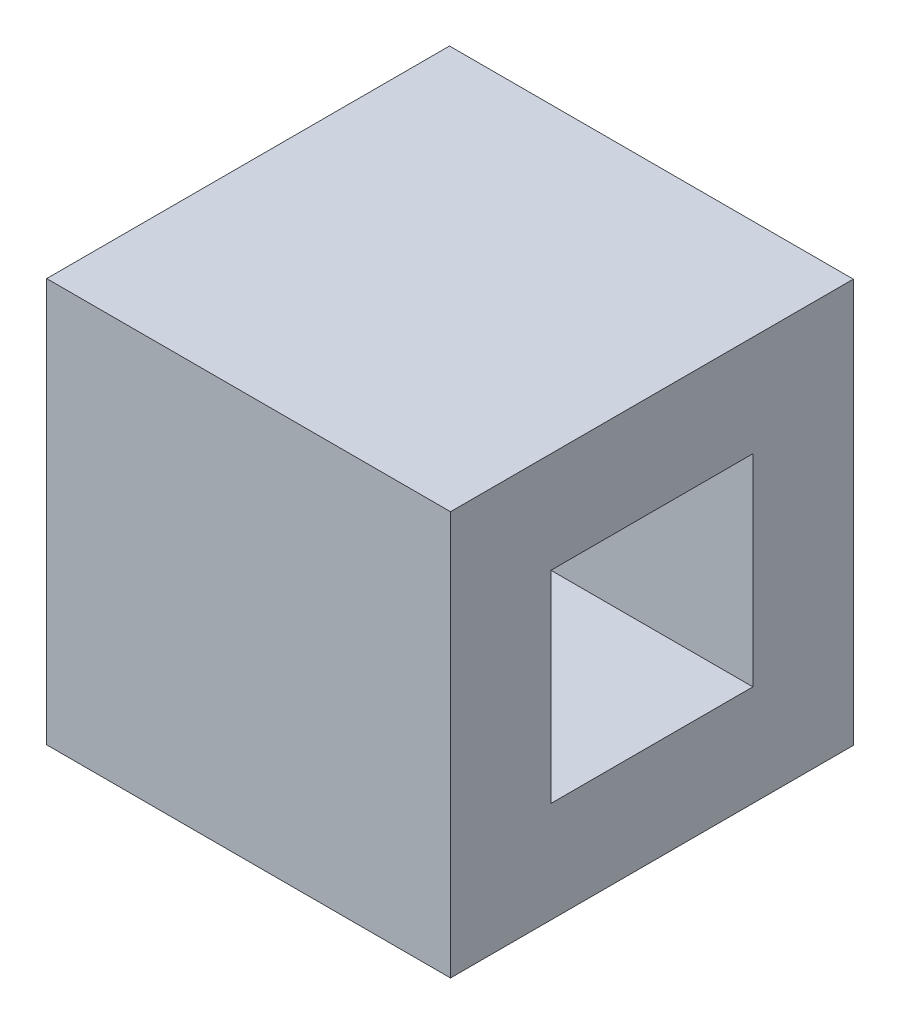
ISO-10303-21;
HEADER;
FILE_DESCRIPTION(('STEP AP214'),'2;1');
FILE_NAME('part.step','',(''),(''),'','','');
FILE_SCHEMA(('AUTOMOTIVE_DESIGN { 1 0 10303 214 1 1 1 1 }'));
ENDSEC;
DATA;
#1=APPLICATION_CONTEXT('core data for automotive mechanical design processes');
#2=APPLICATION_PROTOCOL_DEFINITION('international standard','automotive_design',2000,#1);
#3=PRODUCT_CONTEXT('',#1,'mechanical');
#4=PRODUCT('Part','Part','',(#3));
#5=PRODUCT_RELATED_PRODUCT_CATEGORY('part','',(#4));
#6=PRODUCT_DEFINITION_FORMATION('','',#4);
#7=PRODUCT_DEFINITION_CONTEXT('part definition',#1,'design');
#8=PRODUCT_DEFINITION('design','',#6,#7);
#9=PRODUCT_DEFINITION_SHAPE('','',#8);
#10=(LENGTH_UNIT() NAMED_UNIT(*) SI_UNIT(.MILLI.,.METRE.));
#11=(NAMED_UNIT(*) PLANE_ANGLE_UNIT() SI_UNIT($,.RADIAN.));
#12=(NAMED_UNIT(*) SI_UNIT($,.STERADIAN.) SOLID_ANGLE_UNIT());
#13=UNCERTAINTY_MEASURE_WITH_UNIT(LENGTH_MEASURE(1.E-05),#10,'distance_accuracy_value','');
#14=(GEOMETRIC_REPRESENTATION_CONTEXT(3) GLOBAL_UNCERTAINTY_ASSIGNED_CONTEXT((#13)) GLOBAL_UNIT_ASSIGNED_CONTEXT((#10,
#11,#12)) REPRESENTATION_CONTEXT('',''));
#15=CARTESIAN_POINT('',(0.,0.,0.));
#16=DIRECTION('',(0.,0.,1.));
#17=DIRECTION('',(1.,0.,0.));
#18=AXIS2_PLACEMENT_3D('',#15,#16,#17);
#19=CARTESIAN_POINT('',(0.,40.,0.));
#20=DIRECTION('',(-1.,0.,0.));
#21=DIRECTION('',(0.,0.,1.));
#22=AXIS2_PLACEMENT_3D('',#19,#20,#21);
#23=PLANE('',#22);
#24=DIRECTION('',(0.,0.,-1.));
#25=VECTOR('',#24,1.);
#26=CARTESIAN_POINT('',(0.,10.,-29.95));
#27=LINE('',#26,#25);
#28=CARTESIAN_POINT('',(0.,10.,-9.95));
#29=VERTEX_POINT('',#28);
#30=CARTESIAN_POINT('',(0.,10.,-29.95));
#31=VERTEX_POINT('',#30);
#32=EDGE_CURVE('E137',#29,#31,#27,.T.);
#33=ORIENTED_EDGE('',*,*,#32,.F.);
#34=DIRECTION('',(0.,-1.,0.));
#35=VECTOR('',#34,1.);
#36=CARTESIAN_POINT('',(0.,30.,-9.94999999999999));
#37=LINE('',#36,#35);
#38=CARTESIAN_POINT('',(0.,30.,-9.94999999999999));
#39=VERTEX_POINT('',#38);
#40=EDGE_CURVE('E49',#39,#29,#37,.T.);
#41=ORIENTED_EDGE('',*,*,#40,.F.);
#42=DIRECTION('',(0.,0.,1.));
#43=VECTOR('',#42,1.);
#44=CARTESIAN_POINT('',(0.,30.,-29.95));
#45=LINE('',#44,#43);
#46=CARTESIAN_POINT('',(0.,30.,-29.95));
#47=VERTEX_POINT('',#46);
#48=EDGE_CURVE('E128',#47,#39,#45,.T.);
#49=ORIENTED_EDGE('',*,*,#48,.F.);
#50=DIRECTION('',(0.,1.,0.));
#51=VECTOR('',#50,1.);
#52=CARTESIAN_POINT('',(0.,30.,-29.95));
#53=LINE('',#52,#51);
#54=EDGE_CURVE('E131',#31,#47,#53,.T.);
#55=ORIENTED_EDGE('',*,*,#54,.F.);
#56=EDGE_LOOP('',(#33,#41,#49,#55));
#57=FACE_BOUND('',#56,.T.);
#58=DIRECTION('',(0.,0.,-1.));
#59=VECTOR('',#58,1.);
#60=CARTESIAN_POINT('',(0.,0.,0.));
#61=LINE('',#60,#59);
#62=CARTESIAN_POINT('',(0.,0.,0.));
#63=VERTEX_POINT('',#62);
#64=CARTESIAN_POINT('',(0.,0.,-39.9));
#65=VERTEX_POINT('',#64);
#66=EDGE_CURVE('E143',#63,#65,#61,.T.);
#67=ORIENTED_EDGE('',*,*,#66,.T.);
#68=DIRECTION('',(0.,-1.,0.));
#69=VECTOR('',#68,1.);
#70=CARTESIAN_POINT('',(0.,40.,-39.9));
#71=LINE('',#70,#69);
#72=CARTESIAN_POINT('',(0.,40.,-39.9));
#73=VERTEX_POINT('',#72);
#74=EDGE_CURVE('E11',#73,#65,#71,.T.);
#75=ORIENTED_EDGE('',*,*,#74,.F.);
#76=DIRECTION('',(0.,0.,-1.));
#77=VECTOR('',#76,1.);
#78=CARTESIAN_POINT('',(0.,40.,0.));
#79=LINE('',#78,#77);
#80=CARTESIAN_POINT('',(0.,40.,0.));
#81=VERTEX_POINT('',#80);
#82=EDGE_CURVE('E147',#81,#73,#79,.T.);
#83=ORIENTED_EDGE('',*,*,#82,.F.);
#84=DIRECTION('',(0.,-1.,0.));
#85=VECTOR('',#84,1.);
#86=CARTESIAN_POINT('',(0.,40.,0.));
#87=LINE('',#86,#85);
#88=EDGE_CURVE('E153',#81,#63,#87,.T.);
#89=ORIENTED_EDGE('',*,*,#88,.T.);
#90=EDGE_LOOP('',(#67,#75,#83,#89));
#91=FACE_BOUND('',#90,.T.);
#92=ADVANCED_FACE('F35',(#57,#91),#23,.F.);
#93=CARTESIAN_POINT('',(0.,40.,-39.9));
#94=DIRECTION('',(0.,0.,1.));
#95=DIRECTION('',(1.,0.,0.));
#96=AXIS2_PLACEMENT_3D('',#93,#94,#95);
#97=PLANE('',#96);
#98=DIRECTION('',(-1.,0.,0.));
#99=VECTOR('',#98,1.);
#100=CARTESIAN_POINT('',(0.,0.,-39.9));
#101=LINE('',#100,#99);
#102=CARTESIAN_POINT('',(-40.,0.,-39.9));
#103=VERTEX_POINT('',#102);
#104=EDGE_CURVE('E156',#65,#103,#101,.T.);
#105=ORIENTED_EDGE('',*,*,#104,.T.);
#106=DIRECTION('',(0.,-1.,0.));
#107=VECTOR('',#106,1.);
#108=CARTESIAN_POINT('',(-40.,40.,-39.9));
#109=LINE('',#108,#107);
#110=CARTESIAN_POINT('',(-40.,40.,-39.9));
#111=VERTEX_POINT('',#110);
#112=EDGE_CURVE('E42',#111,#103,#109,.T.);
#113=ORIENTED_EDGE('',*,*,#112,.F.);
#114=DIRECTION('',(-1.,0.,0.));
#115=VECTOR('',#114,1.);
#116=CARTESIAN_POINT('',(0.,40.,-39.9));
#117=LINE('',#116,#115);
#118=EDGE_CURVE('E86',#73,#111,#117,.T.);
#119=ORIENTED_EDGE('',*,*,#118,.F.);
#120=ORIENTED_EDGE('',*,*,#74,.T.);
#121=EDGE_LOOP('',(#105,#113,#119,#120));
#122=FACE_BOUND('',#121,.T.);
#123=ADVANCED_FACE('F184',(#122),#97,.F.);
#124=CARTESIAN_POINT('',(-40.,40.,0.));
#125=DIRECTION('',(1.,0.,0.));
#126=DIRECTION('',(0.,0.,-1.));
#127=AXIS2_PLACEMENT_3D('',#124,#125,#126);
#128=PLANE('',#127);
#129=DIRECTION('',(0.,0.,1.));
#130=VECTOR('',#129,1.);
#131=CARTESIAN_POINT('',(-40.,0.,0.));
#132=LINE('',#131,#130);
#133=CARTESIAN_POINT('',(-40.,0.,0.));
#134=VERTEX_POINT('',#133);
#135=EDGE_CURVE('E158',#103,#134,#132,.T.);
#136=ORIENTED_EDGE('',*,*,#135,.T.);
#137=DIRECTION('',(0.,-1.,0.));
#138=VECTOR('',#137,1.);
#139=CARTESIAN_POINT('',(-40.,40.,0.));
#140=LINE('',#139,#138);
#141=CARTESIAN_POINT('',(-40.,40.,0.));
#142=VERTEX_POINT('',#141);
#143=EDGE_CURVE('E162',#142,#134,#140,.T.);
#144=ORIENTED_EDGE('',*,*,#143,.F.);
#145=DIRECTION('',(0.,0.,1.));
#146=VECTOR('',#145,1.);
#147=CARTESIAN_POINT('',(-40.,40.,0.));
#148=LINE('',#147,#146);
#149=EDGE_CURVE('E150',#111,#142,#148,.T.);
#150=ORIENTED_EDGE('',*,*,#149,.F.);
#151=ORIENTED_EDGE('',*,*,#112,.T.);
#152=EDGE_LOOP('',(#136,#144,#150,#151));
#153=FACE_BOUND('',#152,.T.);
#154=ADVANCED_FACE('F167',(#153),#128,.F.);
#155=CARTESIAN_POINT('',(0.,40.,0.));
#156=DIRECTION('',(0.,0.,-1.));
#157=DIRECTION('',(-1.,0.,0.));
#158=AXIS2_PLACEMENT_3D('',#155,#156,#157);
#159=PLANE('',#158);
#160=DIRECTION('',(1.,0.,0.));
#161=VECTOR('',#160,1.);
#162=CARTESIAN_POINT('',(0.,0.,0.));
#163=LINE('',#162,#161);
#164=EDGE_CURVE('E79',#134,#63,#163,.T.);
#165=ORIENTED_EDGE('',*,*,#164,.T.);
#166=ORIENTED_EDGE('',*,*,#88,.F.);
#167=DIRECTION('',(1.,0.,0.));
#168=VECTOR('',#167,1.);
#169=CARTESIAN_POINT('',(0.,40.,0.));
#170=LINE('',#169,#168);
#171=EDGE_CURVE('E58',#142,#81,#170,.T.);
#172=ORIENTED_EDGE('',*,*,#171,.F.);
#173=ORIENTED_EDGE('',*,*,#143,.T.);
#174=EDGE_LOOP('',(#165,#166,#172,#173));
#175=FACE_BOUND('',#174,.T.);
#176=ADVANCED_FACE('F175',(#175),#159,.F.);
#177=CARTESIAN_POINT('',(0.,40.,0.));
#178=DIRECTION('',(0.,1.,0.));
#179=DIRECTION('',(0.,0.,1.));
#180=AXIS2_PLACEMENT_3D('',#177,#178,#179);
#181=PLANE('',#180);
#182=ORIENTED_EDGE('',*,*,#82,.T.);
#183=ORIENTED_EDGE('',*,*,#118,.T.);
#184=ORIENTED_EDGE('',*,*,#149,.T.);
#185=ORIENTED_EDGE('',*,*,#171,.T.);
#186=EDGE_LOOP('',(#182,#183,#184,#185));
#187=FACE_BOUND('',#186,.T.);
#188=ADVANCED_FACE('F177',(#187),#181,.T.);
#189=CARTESIAN_POINT('',(0.,0.,0.));
#190=DIRECTION('',(0.,1.,0.));
#191=DIRECTION('',(0.,0.,1.));
#192=AXIS2_PLACEMENT_3D('',#189,#190,#191);
#193=PLANE('',#192);
#194=ORIENTED_EDGE('',*,*,#66,.F.);
#195=ORIENTED_EDGE('',*,*,#164,.F.);
#196=ORIENTED_EDGE('',*,*,#135,.F.);
#197=ORIENTED_EDGE('',*,*,#104,.F.);
#198=EDGE_LOOP('',(#194,#195,#196,#197));
#199=FACE_BOUND('',#198,.T.);
#200=ADVANCED_FACE('F171',(#199),#193,.F.);
#201=CARTESIAN_POINT('',(-20.,30.,-9.94999999999999));
#202=DIRECTION('',(0.,0.,1.));
#203=DIRECTION('',(0.,-1.,0.));
#204=AXIS2_PLACEMENT_3D('',#201,#202,#203);
#205=PLANE('',#204);
#206=ORIENTED_EDGE('',*,*,#40,.T.);
#207=DIRECTION('',(1.,0.,0.));
#208=VECTOR('',#207,1.);
#209=CARTESIAN_POINT('',(-20.,10.,-9.95));
#210=LINE('',#209,#208);
#211=CARTESIAN_POINT('',(-20.,10.,-9.95));
#212=VERTEX_POINT('',#211);
#213=EDGE_CURVE('E106',#212,#29,#210,.T.);
#214=ORIENTED_EDGE('',*,*,#213,.F.);
#215=DIRECTION('',(0.,-1.,0.));
#216=VECTOR('',#215,1.);
#217=CARTESIAN_POINT('',(-20.,30.,-9.94999999999999));
#218=LINE('',#217,#216);
#219=CARTESIAN_POINT('',(-20.,30.,-9.94999999999999));
#220=VERTEX_POINT('',#219);
#221=EDGE_CURVE('E110',#220,#212,#218,.T.);
#222=ORIENTED_EDGE('',*,*,#221,.F.);
#223=DIRECTION('',(1.,0.,0.));
#224=VECTOR('',#223,1.);
#225=CARTESIAN_POINT('',(-20.,30.,-9.94999999999999));
#226=LINE('',#225,#224);
#227=EDGE_CURVE('E141',#220,#39,#226,.T.);
#228=ORIENTED_EDGE('',*,*,#227,.T.);
#229=EDGE_LOOP('',(#206,#214,#222,#228));
#230=FACE_BOUND('',#229,.T.);
#231=ADVANCED_FACE('F108',(#230),#205,.F.);
#232=CARTESIAN_POINT('',(-20.,30.,-29.95));
#233=DIRECTION('',(0.,1.,0.));
#234=DIRECTION('',(0.,0.,1.));
#235=AXIS2_PLACEMENT_3D('',#232,#233,#234);
#236=PLANE('',#235);
#237=ORIENTED_EDGE('',*,*,#48,.T.);
#238=ORIENTED_EDGE('',*,*,#227,.F.);
#239=DIRECTION('',(0.,0.,1.));
#240=VECTOR('',#239,1.);
#241=CARTESIAN_POINT('',(-20.,30.,-29.95));
#242=LINE('',#241,#240);
#243=CARTESIAN_POINT('',(-20.,30.,-29.95));
#244=VERTEX_POINT('',#243);
#245=EDGE_CURVE('E116',#244,#220,#242,.T.);
#246=ORIENTED_EDGE('',*,*,#245,.F.);
#247=DIRECTION('',(1.,0.,0.));
#248=VECTOR('',#247,1.);
#249=CARTESIAN_POINT('',(-20.,30.,-29.95));
#250=LINE('',#249,#248);
#251=EDGE_CURVE('E144',#244,#47,#250,.T.);
#252=ORIENTED_EDGE('',*,*,#251,.T.);
#253=EDGE_LOOP('',(#237,#238,#246,#252));
#254=FACE_BOUND('',#253,.T.);
#255=ADVANCED_FACE('F197',(#254),#236,.F.);
#256=CARTESIAN_POINT('',(-20.,30.,-29.95));
#257=DIRECTION('',(0.,0.,-1.));
#258=DIRECTION('',(0.,1.,0.));
#259=AXIS2_PLACEMENT_3D('',#256,#257,#258);
#260=PLANE('',#259);
#261=ORIENTED_EDGE('',*,*,#54,.T.);
#262=ORIENTED_EDGE('',*,*,#251,.F.);
#263=DIRECTION('',(0.,1.,0.));
#264=VECTOR('',#263,1.);
#265=CARTESIAN_POINT('',(-20.,30.,-29.95));
#266=LINE('',#265,#264);
#267=CARTESIAN_POINT('',(-20.,10.,-29.95));
#268=VERTEX_POINT('',#267);
#269=EDGE_CURVE('E124',#268,#244,#266,.T.);
#270=ORIENTED_EDGE('',*,*,#269,.F.);
#271=DIRECTION('',(1.,0.,0.));
#272=VECTOR('',#271,1.);
#273=CARTESIAN_POINT('',(-20.,10.,-29.95));
#274=LINE('',#273,#272);
#275=EDGE_CURVE('E115',#268,#31,#274,.T.);
#276=ORIENTED_EDGE('',*,*,#275,.T.);
#277=EDGE_LOOP('',(#261,#262,#270,#276));
#278=FACE_BOUND('',#277,.T.);
#279=ADVANCED_FACE('F195',(#278),#260,.F.);
#280=CARTESIAN_POINT('',(-20.,10.,-29.95));
#281=DIRECTION('',(0.,-1.,0.));
#282=DIRECTION('',(0.,0.,-1.));
#283=AXIS2_PLACEMENT_3D('',#280,#281,#282);
#284=PLANE('',#283);
#285=ORIENTED_EDGE('',*,*,#32,.T.);
#286=ORIENTED_EDGE('',*,*,#275,.F.);
#287=DIRECTION('',(0.,0.,-1.));
#288=VECTOR('',#287,1.);
#289=CARTESIAN_POINT('',(-20.,10.,-29.95));
#290=LINE('',#289,#288);
#291=EDGE_CURVE('E119',#212,#268,#290,.T.);
#292=ORIENTED_EDGE('',*,*,#291,.F.);
#293=ORIENTED_EDGE('',*,*,#213,.T.);
#294=EDGE_LOOP('',(#285,#286,#292,#293));
#295=FACE_BOUND('',#294,.T.);
#296=ADVANCED_FACE('F120',(#295),#284,.F.);
#297=CARTESIAN_POINT('',(-20.,0.,0.));
#298=DIRECTION('',(-1.,0.,0.));
#299=DIRECTION('',(0.,0.,1.));
#300=AXIS2_PLACEMENT_3D('',#297,#298,#299);
#301=PLANE('',#300);
#302=ORIENTED_EDGE('',*,*,#221,.T.);
#303=ORIENTED_EDGE('',*,*,#291,.T.);
#304=ORIENTED_EDGE('',*,*,#269,.T.);
#305=ORIENTED_EDGE('',*,*,#245,.T.);
#306=EDGE_LOOP('',(#302,#303,#304,#305));
#307=FACE_BOUND('',#306,.T.);
#308=ADVANCED_FACE('F126',(#307),#301,.F.);
#309=CLOSED_SHELL('',(#92,#123,#154,#176,#188,#200,#231,#255,#279,#296,#308));
#310=MANIFOLD_SOLID_BREP('B2',#309);
#311=ADVANCED_BREP_SHAPE_REPRESENTATION('',(#18,#310),#14);
#312=SHAPE_DEFINITION_REPRESENTATION(#9,#311);
ENDSEC;
END-ISO-10303-21;
